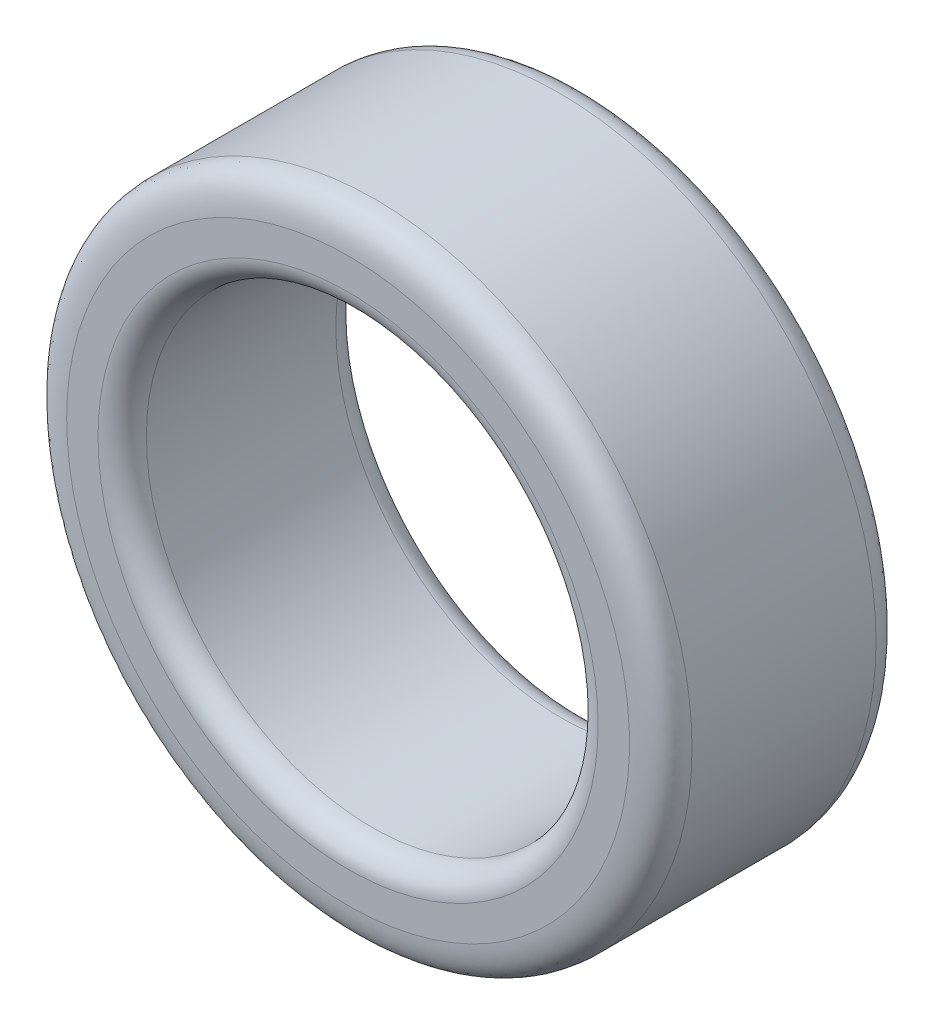
ISO-10303-21;
HEADER;
FILE_DESCRIPTION(('STEP AP214'),'2;1');
FILE_NAME('part.step','',(''),(''),'','','');
FILE_SCHEMA(('AUTOMOTIVE_DESIGN { 1 0 10303 214 1 1 1 1 }'));
ENDSEC;
DATA;
#1=APPLICATION_CONTEXT('core data for automotive mechanical design processes');
#2=APPLICATION_PROTOCOL_DEFINITION('international standard','automotive_design',2000,#1);
#3=PRODUCT_CONTEXT('',#1,'mechanical');
#4=PRODUCT('Part','Part','',(#3));
#5=PRODUCT_RELATED_PRODUCT_CATEGORY('part','',(#4));
#6=PRODUCT_DEFINITION_FORMATION('','',#4);
#7=PRODUCT_DEFINITION_CONTEXT('part definition',#1,'design');
#8=PRODUCT_DEFINITION('design','',#6,#7);
#9=PRODUCT_DEFINITION_SHAPE('','',#8);
#10=(LENGTH_UNIT() NAMED_UNIT(*) SI_UNIT(.MILLI.,.METRE.));
#11=(NAMED_UNIT(*) PLANE_ANGLE_UNIT() SI_UNIT($,.RADIAN.));
#12=(NAMED_UNIT(*) SI_UNIT($,.STERADIAN.) SOLID_ANGLE_UNIT());
#13=UNCERTAINTY_MEASURE_WITH_UNIT(LENGTH_MEASURE(1.E-05),#10,'distance_accuracy_value','');
#14=(GEOMETRIC_REPRESENTATION_CONTEXT(3) GLOBAL_UNCERTAINTY_ASSIGNED_CONTEXT((#13)) GLOBAL_UNIT_ASSIGNED_CONTEXT((#10,
#11,#12)) REPRESENTATION_CONTEXT('',''));
#15=CARTESIAN_POINT('',(0.,0.,0.));
#16=DIRECTION('',(0.,0.,1.));
#17=DIRECTION('',(1.,0.,0.));
#18=AXIS2_PLACEMENT_3D('',#15,#16,#17);
#19=CARTESIAN_POINT('',(0.,0.,46.43));
#20=DIRECTION('',(0.,0.,-1.));
#21=DIRECTION('',(-1.,0.,0.));
#22=AXIS2_PLACEMENT_3D('',#19,#20,#21);
#23=CYLINDRICAL_SURFACE('',#22,80.);
#24=CARTESIAN_POINT('',(0.,0.,46.43));
#25=DIRECTION('',(0.,0.,1.));
#26=DIRECTION('',(1.,0.,0.));
#27=AXIS2_PLACEMENT_3D('',#24,#25,#26);
#28=CIRCLE('',#27,80.);
#29=CARTESIAN_POINT('',(80.,0.,46.43));
#30=VERTEX_POINT('',#29);
#31=EDGE_CURVE('E10',#30,#30,#28,.T.);
#32=ORIENTED_EDGE('',*,*,#31,.F.);
#33=EDGE_LOOP('',(#32));
#34=FACE_BOUND('',#33,.T.);
#35=CARTESIAN_POINT('',(0.,0.,0.));
#36=DIRECTION('',(0.,0.,-1.));
#37=DIRECTION('',(-1.,0.,0.));
#38=AXIS2_PLACEMENT_3D('',#35,#36,#37);
#39=CIRCLE('',#38,80.);
#40=CARTESIAN_POINT('',(-80.,0.,0.));
#41=VERTEX_POINT('',#40);
#42=EDGE_CURVE('E58',#41,#41,#39,.T.);
#43=ORIENTED_EDGE('',*,*,#42,.F.);
#44=EDGE_LOOP('',(#43));
#45=FACE_BOUND('',#44,.T.);
#46=ADVANCED_FACE('F39',(#34,#45),#23,.T.);
#47=CARTESIAN_POINT('',(0.,0.,46.43));
#48=DIRECTION('',(0.,0.,-1.));
#49=DIRECTION('',(-1.,0.,0.));
#50=AXIS2_PLACEMENT_3D('',#47,#48,#49);
#51=CYLINDRICAL_SURFACE('',#50,57.);
#52=CARTESIAN_POINT('',(0.,0.,-0.689038023492372));
#53=DIRECTION('',(0.,0.,-1.));
#54=DIRECTION('',(-1.,0.,0.));
#55=AXIS2_PLACEMENT_3D('',#52,#53,#54);
#56=CIRCLE('',#55,57.);
#57=CARTESIAN_POINT('',(-57.,0.,-0.689038023492372));
#58=VERTEX_POINT('',#57);
#59=EDGE_CURVE('E45',#58,#58,#56,.T.);
#60=ORIENTED_EDGE('',*,*,#59,.T.);
#61=EDGE_LOOP('',(#60));
#62=FACE_BOUND('',#61,.T.);
#63=CARTESIAN_POINT('',(0.,0.,47.1190380234924));
#64=DIRECTION('',(0.,0.,-1.));
#65=DIRECTION('',(-1.,0.,0.));
#66=AXIS2_PLACEMENT_3D('',#63,#64,#65);
#67=CIRCLE('',#66,57.);
#68=CARTESIAN_POINT('',(-57.,0.,47.1190380234924));
#69=VERTEX_POINT('',#68);
#70=EDGE_CURVE('E61',#69,#69,#67,.T.);
#71=ORIENTED_EDGE('',*,*,#70,.F.);
#72=EDGE_LOOP('',(#71));
#73=FACE_BOUND('',#72,.T.);
#74=ADVANCED_FACE('F84',(#62,#73),#51,.F.);
#75=CARTESIAN_POINT('',(0.,0.,-0.689038023492416));
#76=DIRECTION('',(0.,0.,-1.));
#77=DIRECTION('',(-1.,0.,0.));
#78=AXIS2_PLACEMENT_3D('',#75,#76,#77);
#79=TOROIDAL_SURFACE('',#78,63.1009619765076,6.10096197650758);
#80=CARTESIAN_POINT('',(0.,0.,-6.79));
#81=DIRECTION('',(0.,0.,-1.));
#82=DIRECTION('',(-1.,0.,0.));
#83=AXIS2_PLACEMENT_3D('',#80,#81,#82);
#84=CIRCLE('',#83,63.1009619765076);
#85=CARTESIAN_POINT('',(-63.1009619765076,0.,-6.79));
#86=VERTEX_POINT('',#85);
#87=EDGE_CURVE('E49',#86,#86,#84,.T.);
#88=ORIENTED_EDGE('',*,*,#87,.T.);
#89=EDGE_LOOP('',(#88));
#90=FACE_BOUND('',#89,.T.);
#91=ORIENTED_EDGE('',*,*,#59,.F.);
#92=EDGE_LOOP('',(#91));
#93=FACE_BOUND('',#92,.T.);
#94=ADVANCED_FACE('F81',(#90,#93),#79,.T.);
#95=CARTESIAN_POINT('',(0.,64.,-6.79));
#96=DIRECTION('',(0.,0.,-1.));
#97=DIRECTION('',(-1.,0.,0.));
#98=AXIS2_PLACEMENT_3D('',#95,#96,#97);
#99=PLANE('',#98);
#100=CARTESIAN_POINT('',(0.,0.,-6.79));
#101=DIRECTION('',(0.,0.,-1.));
#102=DIRECTION('',(-1.,0.,0.));
#103=AXIS2_PLACEMENT_3D('',#100,#101,#102);
#104=CIRCLE('',#103,71.0152749942734);
#105=CARTESIAN_POINT('',(-71.0152749942734,0.,-6.79));
#106=VERTEX_POINT('',#105);
#107=EDGE_CURVE('E53',#106,#106,#104,.T.);
#108=ORIENTED_EDGE('',*,*,#107,.T.);
#109=EDGE_LOOP('',(#108));
#110=FACE_BOUND('',#109,.T.);
#111=ORIENTED_EDGE('',*,*,#87,.F.);
#112=EDGE_LOOP('',(#111));
#113=FACE_BOUND('',#112,.T.);
#114=ADVANCED_FACE('F76',(#110,#113),#99,.T.);
#115=CARTESIAN_POINT('',(0.,71.0152749942734,-6.79));
#116=CARTESIAN_POINT('',(0.,77.9042994937305,-6.44665327789775));
#117=CARTESIAN_POINT('',(0.,79.8492651757898,-4.02402612592944));
#118=CARTESIAN_POINT('',(0.,80.,0.));
#119=B_SPLINE_CURVE_WITH_KNOTS('',3,(#115,#116,#117,#118),.UNSPECIFIED.,.F.,.F.,(4,4),(0.,1.),.UNSPECIFIED.);
#120=CARTESIAN_POINT('',(0.,0.,0.));
#121=DIRECTION('',(0.,0.,-1.));
#122=AXIS1_PLACEMENT('',#120,#121);
#123=SURFACE_OF_REVOLUTION('',#119,#122);
#124=ORIENTED_EDGE('',*,*,#42,.T.);
#125=EDGE_LOOP('',(#124));
#126=FACE_BOUND('',#125,.T.);
#127=ORIENTED_EDGE('',*,*,#107,.F.);
#128=EDGE_LOOP('',(#127));
#129=FACE_BOUND('',#128,.T.);
#130=ADVANCED_FACE('F71',(#126,#129),#123,.F.);
#131=CARTESIAN_POINT('',(0.,0.,47.1190380234924));
#132=DIRECTION('',(0.,0.,-1.));
#133=DIRECTION('',(-1.,0.,0.));
#134=AXIS2_PLACEMENT_3D('',#131,#132,#133);
#135=TOROIDAL_SURFACE('',#134,63.1009619765076,6.10096197650758);
#136=ORIENTED_EDGE('',*,*,#70,.T.);
#137=EDGE_LOOP('',(#136));
#138=FACE_BOUND('',#137,.T.);
#139=CARTESIAN_POINT('',(0.,0.,53.22));
#140=DIRECTION('',(0.,0.,-1.));
#141=DIRECTION('',(-1.,0.,0.));
#142=AXIS2_PLACEMENT_3D('',#139,#140,#141);
#143=CIRCLE('',#142,63.1009619765076);
#144=CARTESIAN_POINT('',(-63.1009619765076,0.,53.22));
#145=VERTEX_POINT('',#144);
#146=EDGE_CURVE('E95',#145,#145,#143,.T.);
#147=ORIENTED_EDGE('',*,*,#146,.F.);
#148=EDGE_LOOP('',(#147));
#149=FACE_BOUND('',#148,.T.);
#150=ADVANCED_FACE('F75',(#138,#149),#135,.T.);
#151=CARTESIAN_POINT('',(0.,64.,53.22));
#152=DIRECTION('',(0.,0.,1.));
#153=DIRECTION('',(1.,0.,0.));
#154=AXIS2_PLACEMENT_3D('',#151,#152,#153);
#155=PLANE('',#154);
#156=ORIENTED_EDGE('',*,*,#146,.T.);
#157=EDGE_LOOP('',(#156));
#158=FACE_BOUND('',#157,.T.);
#159=CARTESIAN_POINT('',(0.,0.,53.22));
#160=DIRECTION('',(0.,0.,-1.));
#161=DIRECTION('',(-1.,0.,0.));
#162=AXIS2_PLACEMENT_3D('',#159,#160,#161);
#163=CIRCLE('',#162,71.0152749942734);
#164=CARTESIAN_POINT('',(-71.0152749942734,0.,53.22));
#165=VERTEX_POINT('',#164);
#166=EDGE_CURVE('E97',#165,#165,#163,.T.);
#167=ORIENTED_EDGE('',*,*,#166,.F.);
#168=EDGE_LOOP('',(#167));
#169=FACE_BOUND('',#168,.T.);
#170=ADVANCED_FACE('F112',(#158,#169),#155,.T.);
#171=CARTESIAN_POINT('',(0.,80.,46.43));
#172=CARTESIAN_POINT('',(0.,79.8492651757898,50.4540261259295));
#173=CARTESIAN_POINT('',(0.,77.9042994937305,52.8766532778978));
#174=CARTESIAN_POINT('',(0.,71.0152749942734,53.22));
#175=B_SPLINE_CURVE_WITH_KNOTS('',3,(#171,#172,#173,#174),.UNSPECIFIED.,.F.,.F.,(4,4),(0.,1.),.UNSPECIFIED.);
#176=CARTESIAN_POINT('',(0.,0.,0.));
#177=DIRECTION('',(0.,0.,-1.));
#178=AXIS1_PLACEMENT('',#176,#177);
#179=SURFACE_OF_REVOLUTION('',#175,#178);
#180=ORIENTED_EDGE('',*,*,#166,.T.);
#181=EDGE_LOOP('',(#180));
#182=FACE_BOUND('',#181,.T.);
#183=ORIENTED_EDGE('',*,*,#31,.T.);
#184=EDGE_LOOP('',(#183));
#185=FACE_BOUND('',#184,.T.);
#186=ADVANCED_FACE('F110',(#182,#185),#179,.F.);
#187=CLOSED_SHELL('',(#46,#74,#94,#114,#130,#150,#170,#186));
#188=MANIFOLD_SOLID_BREP('B2',#187);
#189=ADVANCED_BREP_SHAPE_REPRESENTATION('',(#18,#188),#14);
#190=SHAPE_DEFINITION_REPRESENTATION(#9,#189);
ENDSEC;
END-ISO-10303-21;
